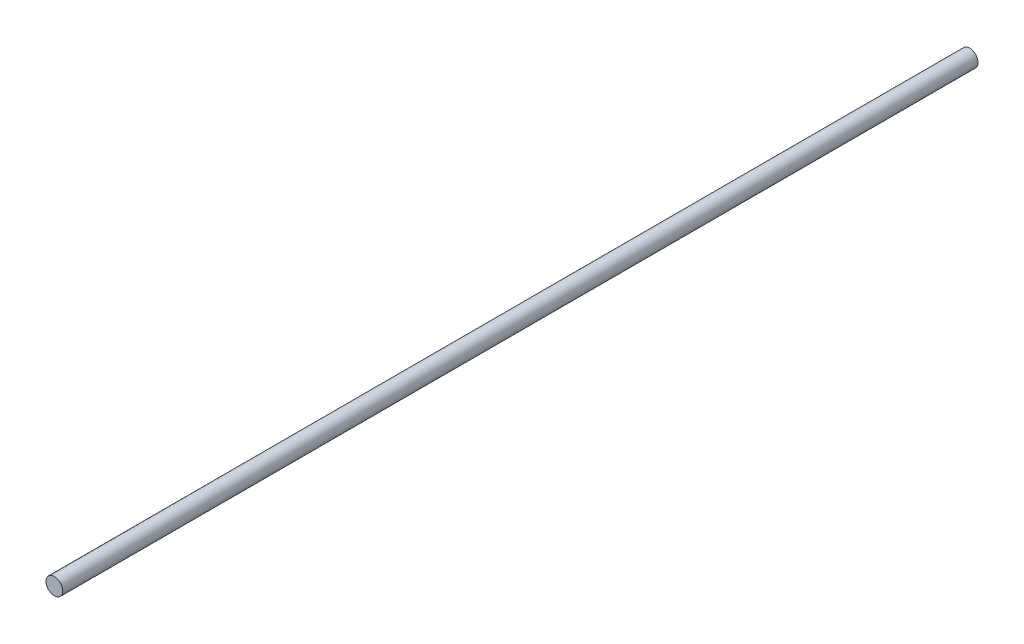
ISO-10303-21;
HEADER;
FILE_DESCRIPTION(('STEP AP214'),'2;1');
FILE_NAME('part.step','',(''),(''),'','','');
FILE_SCHEMA(('AUTOMOTIVE_DESIGN { 1 0 10303 214 1 1 1 1 }'));
ENDSEC;
DATA;
#1=APPLICATION_CONTEXT('core data for automotive mechanical design processes');
#2=APPLICATION_PROTOCOL_DEFINITION('international standard','automotive_design',2000,#1);
#3=PRODUCT_CONTEXT('',#1,'mechanical');
#4=PRODUCT('Part','Part','',(#3));
#5=PRODUCT_RELATED_PRODUCT_CATEGORY('part','',(#4));
#6=PRODUCT_DEFINITION_FORMATION('','',#4);
#7=PRODUCT_DEFINITION_CONTEXT('part definition',#1,'design');
#8=PRODUCT_DEFINITION('design','',#6,#7);
#9=PRODUCT_DEFINITION_SHAPE('','',#8);
#10=(LENGTH_UNIT() NAMED_UNIT(*) SI_UNIT(.MILLI.,.METRE.));
#11=(NAMED_UNIT(*) PLANE_ANGLE_UNIT() SI_UNIT($,.RADIAN.));
#12=(NAMED_UNIT(*) SI_UNIT($,.STERADIAN.) SOLID_ANGLE_UNIT());
#13=UNCERTAINTY_MEASURE_WITH_UNIT(LENGTH_MEASURE(1.E-05),#10,'distance_accuracy_value','');
#14=(GEOMETRIC_REPRESENTATION_CONTEXT(3) GLOBAL_UNCERTAINTY_ASSIGNED_CONTEXT((#13)) GLOBAL_UNIT_ASSIGNED_CONTEXT((#10,
#11,#12)) REPRESENTATION_CONTEXT('',''));
#15=CARTESIAN_POINT('',(0.,0.,0.));
#16=DIRECTION('',(0.,0.,1.));
#17=DIRECTION('',(1.,0.,0.));
#18=AXIS2_PLACEMENT_3D('',#15,#16,#17);
#19=CARTESIAN_POINT('',(0.,0.,300.));
#20=DIRECTION('',(0.,0.,-1.));
#21=DIRECTION('',(-1.,0.,0.));
#22=AXIS2_PLACEMENT_3D('',#19,#20,#21);
#23=CYLINDRICAL_SURFACE('',#22,2.75);
#24=CARTESIAN_POINT('',(0.,0.,300.));
#25=DIRECTION('',(0.,0.,1.));
#26=DIRECTION('',(1.,0.,0.));
#27=AXIS2_PLACEMENT_3D('',#24,#25,#26);
#28=CIRCLE('',#27,2.75);
#29=CARTESIAN_POINT('',(2.75,0.,300.));
#30=VERTEX_POINT('',#29);
#31=EDGE_CURVE('E10',#30,#30,#28,.T.);
#32=ORIENTED_EDGE('',*,*,#31,.F.);
#33=EDGE_LOOP('',(#32));
#34=FACE_BOUND('',#33,.T.);
#35=CARTESIAN_POINT('',(0.,0.,0.));
#36=DIRECTION('',(0.,0.,1.));
#37=DIRECTION('',(1.,0.,0.));
#38=AXIS2_PLACEMENT_3D('',#35,#36,#37);
#39=CIRCLE('',#38,2.75);
#40=CARTESIAN_POINT('',(2.75,0.,0.));
#41=VERTEX_POINT('',#40);
#42=EDGE_CURVE('E34',#41,#41,#39,.T.);
#43=ORIENTED_EDGE('',*,*,#42,.T.);
#44=EDGE_LOOP('',(#43));
#45=FACE_BOUND('',#44,.T.);
#46=ADVANCED_FACE('F31',(#34,#45),#23,.T.);
#47=CARTESIAN_POINT('',(0.,0.,300.));
#48=DIRECTION('',(0.,0.,1.));
#49=DIRECTION('',(1.,0.,0.));
#50=AXIS2_PLACEMENT_3D('',#47,#48,#49);
#51=PLANE('',#50);
#52=ORIENTED_EDGE('',*,*,#31,.T.);
#53=EDGE_LOOP('',(#52));
#54=FACE_BOUND('',#53,.T.);
#55=ADVANCED_FACE('F46',(#54),#51,.T.);
#56=CARTESIAN_POINT('',(0.,0.,0.));
#57=DIRECTION('',(0.,0.,1.));
#58=DIRECTION('',(1.,0.,0.));
#59=AXIS2_PLACEMENT_3D('',#56,#57,#58);
#60=PLANE('',#59);
#61=ORIENTED_EDGE('',*,*,#42,.F.);
#62=EDGE_LOOP('',(#61));
#63=FACE_BOUND('',#62,.T.);
#64=ADVANCED_FACE('F44',(#63),#60,.F.);
#65=CLOSED_SHELL('',(#46,#55,#64));
#66=MANIFOLD_SOLID_BREP('B2',#65);
#67=ADVANCED_BREP_SHAPE_REPRESENTATION('',(#18,#66),#14);
#68=SHAPE_DEFINITION_REPRESENTATION(#9,#67);
ENDSEC;
END-ISO-10303-21;
